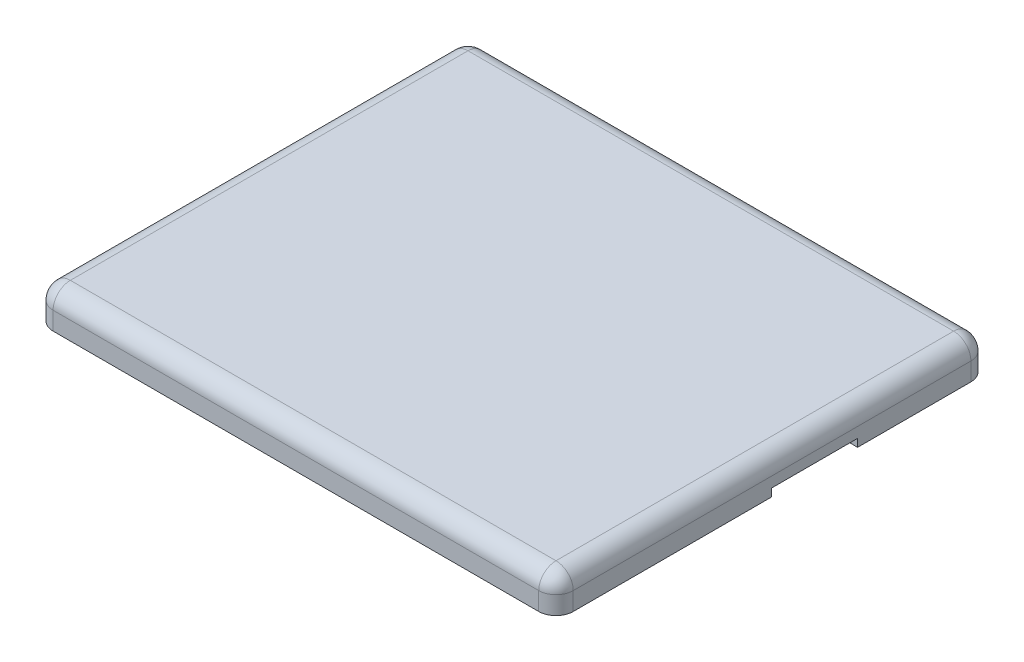
ISO-10303-21;
HEADER;
FILE_DESCRIPTION(('STEP AP214'),'2;1');
FILE_NAME('part.step','',(''),(''),'','','');
FILE_SCHEMA(('AUTOMOTIVE_DESIGN { 1 0 10303 214 1 1 1 1 }'));
ENDSEC;
DATA;
#1=APPLICATION_CONTEXT('core data for automotive mechanical design processes');
#2=APPLICATION_PROTOCOL_DEFINITION('international standard','automotive_design',2000,#1);
#3=PRODUCT_CONTEXT('',#1,'mechanical');
#4=PRODUCT('Part','Part','',(#3));
#5=PRODUCT_RELATED_PRODUCT_CATEGORY('part','',(#4));
#6=PRODUCT_DEFINITION_FORMATION('','',#4);
#7=PRODUCT_DEFINITION_CONTEXT('part definition',#1,'design');
#8=PRODUCT_DEFINITION('design','',#6,#7);
#9=PRODUCT_DEFINITION_SHAPE('','',#8);
#10=(LENGTH_UNIT() NAMED_UNIT(*) SI_UNIT(.MILLI.,.METRE.));
#11=(NAMED_UNIT(*) PLANE_ANGLE_UNIT() SI_UNIT($,.RADIAN.));
#12=(NAMED_UNIT(*) SI_UNIT($,.STERADIAN.) SOLID_ANGLE_UNIT());
#13=UNCERTAINTY_MEASURE_WITH_UNIT(LENGTH_MEASURE(1.E-05),#10,'distance_accuracy_value','');
#14=(GEOMETRIC_REPRESENTATION_CONTEXT(3) GLOBAL_UNCERTAINTY_ASSIGNED_CONTEXT((#13)) GLOBAL_UNIT_ASSIGNED_CONTEXT((#10,
#11,#12)) REPRESENTATION_CONTEXT('',''));
#15=CARTESIAN_POINT('',(0.,0.,0.));
#16=DIRECTION('',(0.,0.,1.));
#17=DIRECTION('',(1.,0.,0.));
#18=AXIS2_PLACEMENT_3D('',#15,#16,#17);
#19=CARTESIAN_POINT('',(-30.15,-2.,25.05));
#20=DIRECTION('',(-1.,0.,0.));
#21=DIRECTION('',(0.,0.,1.));
#22=AXIS2_PLACEMENT_3D('',#19,#20,#21);
#23=PLANE('',#22);
#24=DIRECTION('',(0.,0.,-1.));
#25=VECTOR('',#24,1.);
#26=CARTESIAN_POINT('',(-30.15,-4.1,-25.05));
#27=LINE('',#26,#25);
#28=CARTESIAN_POINT('',(-30.15,-4.1,23.05));
#29=VERTEX_POINT('',#28);
#30=CARTESIAN_POINT('',(-30.15,-4.1,-23.05));
#31=VERTEX_POINT('',#30);
#32=EDGE_CURVE('E227',#29,#31,#27,.T.);
#33=ORIENTED_EDGE('',*,*,#32,.F.);
#34=DIRECTION('',(0.,1.,0.));
#35=VECTOR('',#34,1.);
#36=CARTESIAN_POINT('',(-30.15,-2.,23.05));
#37=LINE('',#36,#35);
#38=CARTESIAN_POINT('',(-30.15,-2.,23.05));
#39=VERTEX_POINT('',#38);
#40=EDGE_CURVE('E264',#29,#39,#37,.T.);
#41=ORIENTED_EDGE('',*,*,#40,.T.);
#42=DIRECTION('',(0.,0.,1.));
#43=VECTOR('',#42,1.);
#44=CARTESIAN_POINT('',(-30.15,-2.,25.05));
#45=LINE('',#44,#43);
#46=CARTESIAN_POINT('',(-30.15,-2.,-23.05));
#47=VERTEX_POINT('',#46);
#48=EDGE_CURVE('E260',#39,#47,#45,.F.);
#49=ORIENTED_EDGE('',*,*,#48,.T.);
#50=DIRECTION('',(0.,1.,0.));
#51=VECTOR('',#50,1.);
#52=CARTESIAN_POINT('',(-30.15,-2.,-23.05));
#53=LINE('',#52,#51);
#54=EDGE_CURVE('E262',#47,#31,#53,.F.);
#55=ORIENTED_EDGE('',*,*,#54,.T.);
#56=EDGE_LOOP('',(#33,#41,#49,#55));
#57=FACE_BOUND('',#56,.T.);
#58=ADVANCED_FACE('F37',(#57),#23,.T.);
#59=CARTESIAN_POINT('',(30.15,-2.,-25.05));
#60=DIRECTION('',(0.,0.,-1.));
#61=DIRECTION('',(-1.,0.,0.));
#62=AXIS2_PLACEMENT_3D('',#59,#60,#61);
#63=PLANE('',#62);
#64=DIRECTION('',(1.,0.,0.));
#65=VECTOR('',#64,1.);
#66=CARTESIAN_POINT('',(-30.15,-4.1,-25.05));
#67=LINE('',#66,#65);
#68=CARTESIAN_POINT('',(-28.15,-4.1,-25.05));
#69=VERTEX_POINT('',#68);
#70=CARTESIAN_POINT('',(28.15,-4.1,-25.05));
#71=VERTEX_POINT('',#70);
#72=EDGE_CURVE('E230',#69,#71,#67,.T.);
#73=ORIENTED_EDGE('',*,*,#72,.F.);
#74=DIRECTION('',(0.,1.,0.));
#75=VECTOR('',#74,1.);
#76=CARTESIAN_POINT('',(-28.15,-2.,-25.05));
#77=LINE('',#76,#75);
#78=CARTESIAN_POINT('',(-28.15,-2.,-25.05));
#79=VERTEX_POINT('',#78);
#80=EDGE_CURVE('E11',#69,#79,#77,.T.);
#81=ORIENTED_EDGE('',*,*,#80,.T.);
#82=DIRECTION('',(-1.,0.,0.));
#83=VECTOR('',#82,1.);
#84=CARTESIAN_POINT('',(30.15,-2.,-25.05));
#85=LINE('',#84,#83);
#86=CARTESIAN_POINT('',(28.15,-2.,-25.05));
#87=VERTEX_POINT('',#86);
#88=EDGE_CURVE('E53',#79,#87,#85,.F.);
#89=ORIENTED_EDGE('',*,*,#88,.T.);
#90=DIRECTION('',(0.,1.,0.));
#91=VECTOR('',#90,1.);
#92=CARTESIAN_POINT('',(28.15,-2.,-25.05));
#93=LINE('',#92,#91);
#94=EDGE_CURVE('E46',#87,#71,#93,.F.);
#95=ORIENTED_EDGE('',*,*,#94,.T.);
#96=EDGE_LOOP('',(#73,#81,#89,#95));
#97=FACE_BOUND('',#96,.T.);
#98=ADVANCED_FACE('F385',(#97),#63,.T.);
#99=CARTESIAN_POINT('',(30.15,-2.,25.05));
#100=DIRECTION('',(1.,0.,0.));
#101=DIRECTION('',(0.,0.,-1.));
#102=AXIS2_PLACEMENT_3D('',#99,#100,#101);
#103=PLANE('',#102);
#104=DIRECTION('',(0.,0.,1.));
#105=VECTOR('',#104,1.);
#106=CARTESIAN_POINT('',(30.15,-4.1,-25.05));
#107=LINE('',#106,#105);
#108=CARTESIAN_POINT('',(30.15,-4.1,-23.05));
#109=VERTEX_POINT('',#108);
#110=CARTESIAN_POINT('',(30.15,-4.1,-9.9167528600836));
#111=VERTEX_POINT('',#110);
#112=EDGE_CURVE('E234',#109,#111,#107,.T.);
#113=ORIENTED_EDGE('',*,*,#112,.F.);
#114=DIRECTION('',(0.,1.,0.));
#115=VECTOR('',#114,1.);
#116=CARTESIAN_POINT('',(30.15,-2.,-23.05));
#117=LINE('',#116,#115);
#118=CARTESIAN_POINT('',(30.15,-2.,-23.05));
#119=VERTEX_POINT('',#118);
#120=EDGE_CURVE('E258',#109,#119,#117,.T.);
#121=ORIENTED_EDGE('',*,*,#120,.T.);
#122=DIRECTION('',(0.,0.,-1.));
#123=VECTOR('',#122,1.);
#124=CARTESIAN_POINT('',(30.15,-2.,25.05));
#125=LINE('',#124,#123);
#126=CARTESIAN_POINT('',(30.15,-2.,23.05));
#127=VERTEX_POINT('',#126);
#128=EDGE_CURVE('E255',#119,#127,#125,.F.);
#129=ORIENTED_EDGE('',*,*,#128,.T.);
#130=DIRECTION('',(0.,1.,0.));
#131=VECTOR('',#130,1.);
#132=CARTESIAN_POINT('',(30.15,-2.,23.05));
#133=LINE('',#132,#131);
#134=CARTESIAN_POINT('',(30.15,-4.1,23.05));
#135=VERTEX_POINT('',#134);
#136=EDGE_CURVE('E253',#127,#135,#133,.F.);
#137=ORIENTED_EDGE('',*,*,#136,.T.);
#138=CARTESIAN_POINT('',(30.15,-4.1,0.0832471399163925));
#139=VERTEX_POINT('',#138);
#140=EDGE_CURVE('E233',#139,#135,#107,.T.);
#141=ORIENTED_EDGE('',*,*,#140,.F.);
#142=DIRECTION('',(0.,-1.,0.));
#143=VECTOR('',#142,1.);
#144=CARTESIAN_POINT('',(30.15,-6.9,0.0832471399163925));
#145=LINE('',#144,#143);
#146=CARTESIAN_POINT('',(30.15,-3.2,0.0832471399163925));
#147=VERTEX_POINT('',#146);
#148=EDGE_CURVE('E183',#147,#139,#145,.T.);
#149=ORIENTED_EDGE('',*,*,#148,.F.);
#150=DIRECTION('',(0.,0.,1.));
#151=VECTOR('',#150,1.);
#152=CARTESIAN_POINT('',(30.15,-3.2,0.0832471399163925));
#153=LINE('',#152,#151);
#154=CARTESIAN_POINT('',(30.15,-3.2,-9.9167528600836));
#155=VERTEX_POINT('',#154);
#156=EDGE_CURVE('E167',#155,#147,#153,.T.);
#157=ORIENTED_EDGE('',*,*,#156,.F.);
#158=DIRECTION('',(0.,1.,0.));
#159=VECTOR('',#158,1.);
#160=CARTESIAN_POINT('',(30.15,-6.9,-9.9167528600836));
#161=LINE('',#160,#159);
#162=EDGE_CURVE('E177',#111,#155,#161,.T.);
#163=ORIENTED_EDGE('',*,*,#162,.F.);
#164=EDGE_LOOP('',(#113,#121,#129,#137,#141,#149,#157,#163));
#165=FACE_BOUND('',#164,.T.);
#166=ADVANCED_FACE('F185',(#165),#103,.T.);
#167=CARTESIAN_POINT('',(30.15,-2.,25.05));
#168=DIRECTION('',(0.,0.,1.));
#169=DIRECTION('',(1.,0.,0.));
#170=AXIS2_PLACEMENT_3D('',#167,#168,#169);
#171=PLANE('',#170);
#172=DIRECTION('',(1.,0.,0.));
#173=VECTOR('',#172,1.);
#174=CARTESIAN_POINT('',(30.15,-2.,25.05));
#175=LINE('',#174,#173);
#176=CARTESIAN_POINT('',(28.15,-2.,25.05));
#177=VERTEX_POINT('',#176);
#178=CARTESIAN_POINT('',(-28.15,-2.,25.05));
#179=VERTEX_POINT('',#178);
#180=EDGE_CURVE('E266',#177,#179,#175,.F.);
#181=ORIENTED_EDGE('',*,*,#180,.T.);
#182=DIRECTION('',(0.,1.,0.));
#183=VECTOR('',#182,1.);
#184=CARTESIAN_POINT('',(-28.15,-2.,25.05));
#185=LINE('',#184,#183);
#186=CARTESIAN_POINT('',(-28.15,-4.1,25.05));
#187=VERTEX_POINT('',#186);
#188=EDGE_CURVE('E270',#179,#187,#185,.F.);
#189=ORIENTED_EDGE('',*,*,#188,.T.);
#190=DIRECTION('',(-1.,0.,0.));
#191=VECTOR('',#190,1.);
#192=CARTESIAN_POINT('',(-30.15,-4.1,25.05));
#193=LINE('',#192,#191);
#194=CARTESIAN_POINT('',(28.15,-4.1,25.05));
#195=VERTEX_POINT('',#194);
#196=EDGE_CURVE('E236',#195,#187,#193,.T.);
#197=ORIENTED_EDGE('',*,*,#196,.F.);
#198=DIRECTION('',(0.,1.,0.));
#199=VECTOR('',#198,1.);
#200=CARTESIAN_POINT('',(28.15,-2.,25.05));
#201=LINE('',#200,#199);
#202=EDGE_CURVE('E268',#195,#177,#201,.T.);
#203=ORIENTED_EDGE('',*,*,#202,.T.);
#204=EDGE_LOOP('',(#181,#189,#197,#203));
#205=FACE_BOUND('',#204,.T.);
#206=ADVANCED_FACE('F334',(#205),#171,.T.);
#207=CARTESIAN_POINT('',(0.,0.,0.));
#208=DIRECTION('',(0.,1.,0.));
#209=DIRECTION('',(0.,0.,1.));
#210=AXIS2_PLACEMENT_3D('',#207,#208,#209);
#211=PLANE('',#210);
#212=DIRECTION('',(1.,0.,0.));
#213=VECTOR('',#212,1.);
#214=CARTESIAN_POINT('',(0.,0.,23.05));
#215=LINE('',#214,#213);
#216=CARTESIAN_POINT('',(-28.15,0.,23.05));
#217=VERTEX_POINT('',#216);
#218=CARTESIAN_POINT('',(28.15,0.,23.05));
#219=VERTEX_POINT('',#218);
#220=EDGE_CURVE('E248',#217,#219,#215,.T.);
#221=ORIENTED_EDGE('',*,*,#220,.T.);
#222=DIRECTION('',(0.,0.,-1.));
#223=VECTOR('',#222,1.);
#224=CARTESIAN_POINT('',(28.15,0.,0.));
#225=LINE('',#224,#223);
#226=CARTESIAN_POINT('',(28.15,0.,-23.05));
#227=VERTEX_POINT('',#226);
#228=EDGE_CURVE('E250',#219,#227,#225,.T.);
#229=ORIENTED_EDGE('',*,*,#228,.T.);
#230=DIRECTION('',(-1.,0.,0.));
#231=VECTOR('',#230,1.);
#232=CARTESIAN_POINT('',(0.,0.,-23.05));
#233=LINE('',#232,#231);
#234=CARTESIAN_POINT('',(-28.15,0.,-23.05));
#235=VERTEX_POINT('',#234);
#236=EDGE_CURVE('E244',#227,#235,#233,.T.);
#237=ORIENTED_EDGE('',*,*,#236,.T.);
#238=DIRECTION('',(0.,0.,1.));
#239=VECTOR('',#238,1.);
#240=CARTESIAN_POINT('',(-28.15,0.,0.));
#241=LINE('',#240,#239);
#242=EDGE_CURVE('E246',#235,#217,#241,.T.);
#243=ORIENTED_EDGE('',*,*,#242,.T.);
#244=EDGE_LOOP('',(#221,#229,#237,#243));
#245=FACE_BOUND('',#244,.T.);
#246=ADVANCED_FACE('F580',(#245),#211,.T.);
#247=CARTESIAN_POINT('',(0.,-4.1,0.));
#248=DIRECTION('',(0.,1.,0.));
#249=DIRECTION('',(0.,0.,1.));
#250=AXIS2_PLACEMENT_3D('',#247,#248,#249);
#251=PLANE('',#250);
#252=ORIENTED_EDGE('',*,*,#196,.T.);
#253=CARTESIAN_POINT('',(-28.15,-4.1,23.05));
#254=DIRECTION('',(0.,1.,0.));
#255=DIRECTION('',(0.,0.,1.));
#256=AXIS2_PLACEMENT_3D('',#253,#254,#255);
#257=CIRCLE('',#256,2.);
#258=EDGE_CURVE('E278',#187,#29,#257,.F.);
#259=ORIENTED_EDGE('',*,*,#258,.T.);
#260=ORIENTED_EDGE('',*,*,#32,.T.);
#261=CARTESIAN_POINT('',(-28.15,-4.1,-23.05));
#262=DIRECTION('',(0.,1.,0.));
#263=DIRECTION('',(0.,0.,1.));
#264=AXIS2_PLACEMENT_3D('',#261,#262,#263);
#265=CIRCLE('',#264,2.);
#266=EDGE_CURVE('E276',#31,#69,#265,.F.);
#267=ORIENTED_EDGE('',*,*,#266,.T.);
#268=ORIENTED_EDGE('',*,*,#72,.T.);
#269=CARTESIAN_POINT('',(28.15,-4.1,-23.05));
#270=DIRECTION('',(0.,1.,0.));
#271=DIRECTION('',(0.,0.,1.));
#272=AXIS2_PLACEMENT_3D('',#269,#270,#271);
#273=CIRCLE('',#272,2.);
#274=EDGE_CURVE('E274',#71,#109,#273,.F.);
#275=ORIENTED_EDGE('',*,*,#274,.T.);
#276=ORIENTED_EDGE('',*,*,#112,.T.);
#277=DIRECTION('',(-1.,0.,0.));
#278=VECTOR('',#277,1.);
#279=CARTESIAN_POINT('',(0.,-4.1,-9.9167528600836));
#280=LINE('',#279,#278);
#281=CARTESIAN_POINT('',(28.95,-4.1,-9.9167528600836));
#282=VERTEX_POINT('',#281);
#283=EDGE_CURVE('E180',#111,#282,#280,.T.);
#284=ORIENTED_EDGE('',*,*,#283,.T.);
#285=DIRECTION('',(0.,0.,1.));
#286=VECTOR('',#285,1.);
#287=CARTESIAN_POINT('',(28.95,-4.1,-23.85));
#288=LINE('',#287,#286);
#289=CARTESIAN_POINT('',(28.95,-4.1,-23.85));
#290=VERTEX_POINT('',#289);
#291=EDGE_CURVE('E200',#290,#282,#288,.T.);
#292=ORIENTED_EDGE('',*,*,#291,.F.);
#293=DIRECTION('',(1.,0.,0.));
#294=VECTOR('',#293,1.);
#295=CARTESIAN_POINT('',(-28.95,-4.1,-23.85));
#296=LINE('',#295,#294);
#297=CARTESIAN_POINT('',(-28.95,-4.1,-23.85));
#298=VERTEX_POINT('',#297);
#299=EDGE_CURVE('E196',#298,#290,#296,.T.);
#300=ORIENTED_EDGE('',*,*,#299,.F.);
#301=DIRECTION('',(0.,0.,-1.));
#302=VECTOR('',#301,1.);
#303=CARTESIAN_POINT('',(-28.95,-4.1,-23.85));
#304=LINE('',#303,#302);
#305=CARTESIAN_POINT('',(-28.95,-4.1,23.85));
#306=VERTEX_POINT('',#305);
#307=EDGE_CURVE('E206',#306,#298,#304,.T.);
#308=ORIENTED_EDGE('',*,*,#307,.F.);
#309=DIRECTION('',(-1.,0.,0.));
#310=VECTOR('',#309,1.);
#311=CARTESIAN_POINT('',(-28.95,-4.1,23.85));
#312=LINE('',#311,#310);
#313=CARTESIAN_POINT('',(28.95,-4.1,23.85));
#314=VERTEX_POINT('',#313);
#315=EDGE_CURVE('E203',#314,#306,#312,.T.);
#316=ORIENTED_EDGE('',*,*,#315,.F.);
#317=CARTESIAN_POINT('',(28.95,-4.1,0.0832471399163925));
#318=VERTEX_POINT('',#317);
#319=EDGE_CURVE('E198',#318,#314,#288,.T.);
#320=ORIENTED_EDGE('',*,*,#319,.F.);
#321=DIRECTION('',(1.,0.,0.));
#322=VECTOR('',#321,1.);
#323=CARTESIAN_POINT('',(0.,-4.1,0.0832471399163925));
#324=LINE('',#323,#322);
#325=EDGE_CURVE('E192',#318,#139,#324,.T.);
#326=ORIENTED_EDGE('',*,*,#325,.T.);
#327=ORIENTED_EDGE('',*,*,#140,.T.);
#328=CARTESIAN_POINT('',(28.15,-4.1,23.05));
#329=DIRECTION('',(0.,1.,0.));
#330=DIRECTION('',(0.,0.,1.));
#331=AXIS2_PLACEMENT_3D('',#328,#329,#330);
#332=CIRCLE('',#331,2.);
#333=EDGE_CURVE('E272',#135,#195,#332,.F.);
#334=ORIENTED_EDGE('',*,*,#333,.T.);
#335=EDGE_LOOP('',(#252,#259,#260,#267,#268,#275,#276,#284,#292,#300,#308,#316,#320,#326,#327,#334));
#336=FACE_BOUND('',#335,.T.);
#337=ADVANCED_FACE('F322',(#336),#251,.F.);
#338=CARTESIAN_POINT('',(-28.95,-4.1,-23.85));
#339=DIRECTION('',(0.,0.,1.));
#340=DIRECTION('',(1.,0.,0.));
#341=AXIS2_PLACEMENT_3D('',#338,#339,#340);
#342=PLANE('',#341);
#343=DIRECTION('',(1.,0.,0.));
#344=VECTOR('',#343,1.);
#345=CARTESIAN_POINT('',(-28.95,-2.,-23.85));
#346=LINE('',#345,#344);
#347=CARTESIAN_POINT('',(-28.95,-2.,-23.85));
#348=VERTEX_POINT('',#347);
#349=CARTESIAN_POINT('',(28.95,-2.,-23.85));
#350=VERTEX_POINT('',#349);
#351=EDGE_CURVE('E195',#348,#350,#346,.T.);
#352=ORIENTED_EDGE('',*,*,#351,.F.);
#353=DIRECTION('',(0.,1.,0.));
#354=VECTOR('',#353,1.);
#355=CARTESIAN_POINT('',(-28.95,-4.1,-23.85));
#356=LINE('',#355,#354);
#357=EDGE_CURVE('E208',#298,#348,#356,.T.);
#358=ORIENTED_EDGE('',*,*,#357,.F.);
#359=ORIENTED_EDGE('',*,*,#299,.T.);
#360=DIRECTION('',(0.,1.,0.));
#361=VECTOR('',#360,1.);
#362=CARTESIAN_POINT('',(28.95,-4.1,-23.85));
#363=LINE('',#362,#361);
#364=EDGE_CURVE('E224',#290,#350,#363,.T.);
#365=ORIENTED_EDGE('',*,*,#364,.T.);
#366=EDGE_LOOP('',(#352,#358,#359,#365));
#367=FACE_BOUND('',#366,.T.);
#368=ADVANCED_FACE('F561',(#367),#342,.T.);
#369=CARTESIAN_POINT('',(28.95,-4.1,-23.85));
#370=DIRECTION('',(-1.,0.,0.));
#371=DIRECTION('',(0.,0.,1.));
#372=AXIS2_PLACEMENT_3D('',#369,#370,#371);
#373=PLANE('',#372);
#374=DIRECTION('',(0.,1.,0.));
#375=VECTOR('',#374,1.);
#376=CARTESIAN_POINT('',(28.95,-4.1,0.0832471399163925));
#377=LINE('',#376,#375);
#378=CARTESIAN_POINT('',(28.95,-3.2,0.0832471399163925));
#379=VERTEX_POINT('',#378);
#380=EDGE_CURVE('E242',#318,#379,#377,.T.);
#381=ORIENTED_EDGE('',*,*,#380,.F.);
#382=ORIENTED_EDGE('',*,*,#319,.T.);
#383=DIRECTION('',(0.,1.,0.));
#384=VECTOR('',#383,1.);
#385=CARTESIAN_POINT('',(28.95,-4.1,23.85));
#386=LINE('',#385,#384);
#387=CARTESIAN_POINT('',(28.95,-2.,23.85));
#388=VERTEX_POINT('',#387);
#389=EDGE_CURVE('E222',#314,#388,#386,.T.);
#390=ORIENTED_EDGE('',*,*,#389,.T.);
#391=DIRECTION('',(0.,0.,1.));
#392=VECTOR('',#391,1.);
#393=CARTESIAN_POINT('',(28.95,-2.,-23.85));
#394=LINE('',#393,#392);
#395=EDGE_CURVE('E211',#350,#388,#394,.T.);
#396=ORIENTED_EDGE('',*,*,#395,.F.);
#397=ORIENTED_EDGE('',*,*,#364,.F.);
#398=ORIENTED_EDGE('',*,*,#291,.T.);
#399=DIRECTION('',(0.,-1.,0.));
#400=VECTOR('',#399,1.);
#401=CARTESIAN_POINT('',(28.95,-4.1,-9.9167528600836));
#402=LINE('',#401,#400);
#403=CARTESIAN_POINT('',(28.95,-3.2,-9.9167528600836));
#404=VERTEX_POINT('',#403);
#405=EDGE_CURVE('E239',#404,#282,#402,.T.);
#406=ORIENTED_EDGE('',*,*,#405,.F.);
#407=DIRECTION('',(0.,0.,-1.));
#408=VECTOR('',#407,1.);
#409=CARTESIAN_POINT('',(28.95,-3.2,-23.85));
#410=LINE('',#409,#408);
#411=EDGE_CURVE('E170',#379,#404,#410,.T.);
#412=ORIENTED_EDGE('',*,*,#411,.F.);
#413=EDGE_LOOP('',(#381,#382,#390,#396,#397,#398,#406,#412));
#414=FACE_BOUND('',#413,.T.);
#415=ADVANCED_FACE('F550',(#414),#373,.T.);
#416=CARTESIAN_POINT('',(-28.95,-4.1,23.85));
#417=DIRECTION('',(0.,0.,-1.));
#418=DIRECTION('',(-1.,0.,0.));
#419=AXIS2_PLACEMENT_3D('',#416,#417,#418);
#420=PLANE('',#419);
#421=DIRECTION('',(-1.,0.,0.));
#422=VECTOR('',#421,1.);
#423=CARTESIAN_POINT('',(-28.95,-2.,23.85));
#424=LINE('',#423,#422);
#425=CARTESIAN_POINT('',(-28.95,-2.,23.85));
#426=VERTEX_POINT('',#425);
#427=EDGE_CURVE('E214',#388,#426,#424,.T.);
#428=ORIENTED_EDGE('',*,*,#427,.F.);
#429=ORIENTED_EDGE('',*,*,#389,.F.);
#430=ORIENTED_EDGE('',*,*,#315,.T.);
#431=DIRECTION('',(0.,1.,0.));
#432=VECTOR('',#431,1.);
#433=CARTESIAN_POINT('',(-28.95,-4.1,23.85));
#434=LINE('',#433,#432);
#435=EDGE_CURVE('E220',#306,#426,#434,.T.);
#436=ORIENTED_EDGE('',*,*,#435,.T.);
#437=EDGE_LOOP('',(#428,#429,#430,#436));
#438=FACE_BOUND('',#437,.T.);
#439=ADVANCED_FACE('F538',(#438),#420,.T.);
#440=CARTESIAN_POINT('',(-28.95,-4.1,-23.85));
#441=DIRECTION('',(1.,0.,0.));
#442=DIRECTION('',(0.,0.,-1.));
#443=AXIS2_PLACEMENT_3D('',#440,#441,#442);
#444=PLANE('',#443);
#445=DIRECTION('',(0.,0.,-1.));
#446=VECTOR('',#445,1.);
#447=CARTESIAN_POINT('',(-28.95,-2.,-23.85));
#448=LINE('',#447,#446);
#449=EDGE_CURVE('E199',#426,#348,#448,.T.);
#450=ORIENTED_EDGE('',*,*,#449,.F.);
#451=ORIENTED_EDGE('',*,*,#435,.F.);
#452=ORIENTED_EDGE('',*,*,#307,.T.);
#453=ORIENTED_EDGE('',*,*,#357,.T.);
#454=EDGE_LOOP('',(#450,#451,#452,#453));
#455=FACE_BOUND('',#454,.T.);
#456=ADVANCED_FACE('F532',(#455),#444,.T.);
#457=CARTESIAN_POINT('',(0.,-2.,0.));
#458=DIRECTION('',(0.,1.,0.));
#459=DIRECTION('',(0.,0.,1.));
#460=AXIS2_PLACEMENT_3D('',#457,#458,#459);
#461=PLANE('',#460);
#462=ORIENTED_EDGE('',*,*,#449,.T.);
#463=ORIENTED_EDGE('',*,*,#351,.T.);
#464=ORIENTED_EDGE('',*,*,#395,.T.);
#465=ORIENTED_EDGE('',*,*,#427,.T.);
#466=EDGE_LOOP('',(#462,#463,#464,#465));
#467=FACE_BOUND('',#466,.T.);
#468=ADVANCED_FACE('F526',(#467),#461,.F.);
#469=CARTESIAN_POINT('',(10.15,-6.9,0.0832471399163925));
#470=DIRECTION('',(0.,0.,1.));
#471=DIRECTION('',(1.,0.,0.));
#472=AXIS2_PLACEMENT_3D('',#469,#470,#471);
#473=PLANE('',#472);
#474=ORIENTED_EDGE('',*,*,#380,.T.);
#475=DIRECTION('',(1.,0.,0.));
#476=VECTOR('',#475,1.);
#477=CARTESIAN_POINT('',(10.15,-3.2,0.0832471399163925));
#478=LINE('',#477,#476);
#479=EDGE_CURVE('E173',#379,#147,#478,.T.);
#480=ORIENTED_EDGE('',*,*,#479,.T.);
#481=ORIENTED_EDGE('',*,*,#148,.T.);
#482=ORIENTED_EDGE('',*,*,#325,.F.);
#483=EDGE_LOOP('',(#474,#480,#481,#482));
#484=FACE_BOUND('',#483,.T.);
#485=ADVANCED_FACE('F317',(#484),#473,.F.);
#486=CARTESIAN_POINT('',(10.15,-6.9,-9.9167528600836));
#487=DIRECTION('',(0.,0.,-1.));
#488=DIRECTION('',(-1.,0.,0.));
#489=AXIS2_PLACEMENT_3D('',#486,#487,#488);
#490=PLANE('',#489);
#491=ORIENTED_EDGE('',*,*,#162,.T.);
#492=DIRECTION('',(1.,0.,0.));
#493=VECTOR('',#492,1.);
#494=CARTESIAN_POINT('',(10.15,-3.2,-9.9167528600836));
#495=LINE('',#494,#493);
#496=EDGE_CURVE('E162',#404,#155,#495,.T.);
#497=ORIENTED_EDGE('',*,*,#496,.F.);
#498=ORIENTED_EDGE('',*,*,#405,.T.);
#499=ORIENTED_EDGE('',*,*,#283,.F.);
#500=EDGE_LOOP('',(#491,#497,#498,#499));
#501=FACE_BOUND('',#500,.T.);
#502=ADVANCED_FACE('F178',(#501),#490,.F.);
#503=CARTESIAN_POINT('',(10.15,-3.2,0.0832471399163925));
#504=DIRECTION('',(0.,1.,0.));
#505=DIRECTION('',(0.,0.,1.));
#506=AXIS2_PLACEMENT_3D('',#503,#504,#505);
#507=PLANE('',#506);
#508=ORIENTED_EDGE('',*,*,#411,.T.);
#509=ORIENTED_EDGE('',*,*,#496,.T.);
#510=ORIENTED_EDGE('',*,*,#156,.T.);
#511=ORIENTED_EDGE('',*,*,#479,.F.);
#512=EDGE_LOOP('',(#508,#509,#510,#511));
#513=FACE_BOUND('',#512,.T.);
#514=ADVANCED_FACE('F164',(#513),#507,.F.);
#515=CARTESIAN_POINT('',(-28.15,-2.,23.05));
#516=DIRECTION('',(0.,1.,0.));
#517=DIRECTION('',(0.,0.,1.));
#518=AXIS2_PLACEMENT_3D('',#515,#516,#517);
#519=CYLINDRICAL_SURFACE('',#518,2.);
#520=ORIENTED_EDGE('',*,*,#258,.F.);
#521=ORIENTED_EDGE('',*,*,#188,.F.);
#522=CARTESIAN_POINT('',(-28.15,-2.,23.05));
#523=DIRECTION('',(0.,1.,0.));
#524=DIRECTION('',(0.,0.,1.));
#525=AXIS2_PLACEMENT_3D('',#522,#523,#524);
#526=CIRCLE('',#525,2.);
#527=EDGE_CURVE('E41',#39,#179,#526,.T.);
#528=ORIENTED_EDGE('',*,*,#527,.F.);
#529=ORIENTED_EDGE('',*,*,#40,.F.);
#530=EDGE_LOOP('',(#520,#521,#528,#529));
#531=FACE_BOUND('',#530,.T.);
#532=ADVANCED_FACE('F39',(#531),#519,.T.);
#533=CARTESIAN_POINT('',(-28.15,-2.,0.));
#534=DIRECTION('',(0.,0.,1.));
#535=DIRECTION('',(1.,0.,0.));
#536=AXIS2_PLACEMENT_3D('',#533,#534,#535);
#537=CYLINDRICAL_SURFACE('',#536,2.);
#538=CARTESIAN_POINT('',(-28.15,-2.,-23.05));
#539=DIRECTION('',(0.,0.,-1.));
#540=DIRECTION('',(-1.,0.,0.));
#541=AXIS2_PLACEMENT_3D('',#538,#539,#540);
#542=CIRCLE('',#541,2.);
#543=EDGE_CURVE('E307',#47,#235,#542,.T.);
#544=ORIENTED_EDGE('',*,*,#543,.F.);
#545=ORIENTED_EDGE('',*,*,#48,.F.);
#546=CARTESIAN_POINT('',(-28.15,-2.,23.05));
#547=DIRECTION('',(0.,0.,1.));
#548=DIRECTION('',(1.,0.,0.));
#549=AXIS2_PLACEMENT_3D('',#546,#547,#548);
#550=CIRCLE('',#549,2.);
#551=EDGE_CURVE('E309',#217,#39,#550,.T.);
#552=ORIENTED_EDGE('',*,*,#551,.F.);
#553=ORIENTED_EDGE('',*,*,#242,.F.);
#554=EDGE_LOOP('',(#544,#545,#552,#553));
#555=FACE_BOUND('',#554,.T.);
#556=ADVANCED_FACE('F350',(#555),#537,.T.);
#557=CARTESIAN_POINT('',(-28.15,-2.,-23.05));
#558=DIRECTION('',(0.,1.,0.));
#559=DIRECTION('',(0.,0.,1.));
#560=AXIS2_PLACEMENT_3D('',#557,#558,#559);
#561=CYLINDRICAL_SURFACE('',#560,2.);
#562=ORIENTED_EDGE('',*,*,#266,.F.);
#563=ORIENTED_EDGE('',*,*,#54,.F.);
#564=CARTESIAN_POINT('',(-28.15,-2.,-23.05));
#565=DIRECTION('',(0.,1.,0.));
#566=DIRECTION('',(0.,0.,1.));
#567=AXIS2_PLACEMENT_3D('',#564,#565,#566);
#568=CIRCLE('',#567,2.);
#569=EDGE_CURVE('E304',#79,#47,#568,.T.);
#570=ORIENTED_EDGE('',*,*,#569,.F.);
#571=ORIENTED_EDGE('',*,*,#80,.F.);
#572=EDGE_LOOP('',(#562,#563,#570,#571));
#573=FACE_BOUND('',#572,.T.);
#574=ADVANCED_FACE('F346',(#573),#561,.T.);
#575=CARTESIAN_POINT('',(-28.15,-2.,23.05));
#576=DIRECTION('',(-1.,0.,0.));
#577=DIRECTION('',(0.,0.,1.));
#578=AXIS2_PLACEMENT_3D('',#575,#576,#577);
#579=SPHERICAL_SURFACE('',#578,2.);
#580=ORIENTED_EDGE('',*,*,#551,.T.);
#581=ORIENTED_EDGE('',*,*,#527,.T.);
#582=CARTESIAN_POINT('',(-28.15,-2.,23.05));
#583=DIRECTION('',(-1.,0.,0.));
#584=DIRECTION('',(0.,0.,1.));
#585=AXIS2_PLACEMENT_3D('',#582,#583,#584);
#586=CIRCLE('',#585,2.);
#587=EDGE_CURVE('E301',#217,#179,#586,.F.);
#588=ORIENTED_EDGE('',*,*,#587,.F.);
#589=EDGE_LOOP('',(#580,#581,#588));
#590=FACE_BOUND('',#589,.T.);
#591=ADVANCED_FACE('F375',(#590),#579,.T.);
#592=CARTESIAN_POINT('',(-28.15,-2.,-23.05));
#593=DIRECTION('',(-1.,0.,0.));
#594=DIRECTION('',(0.,0.,1.));
#595=AXIS2_PLACEMENT_3D('',#592,#593,#594);
#596=SPHERICAL_SURFACE('',#595,2.);
#597=ORIENTED_EDGE('',*,*,#569,.T.);
#598=ORIENTED_EDGE('',*,*,#543,.T.);
#599=CARTESIAN_POINT('',(-28.15,-2.,-23.05));
#600=DIRECTION('',(-1.,0.,0.));
#601=DIRECTION('',(0.,0.,1.));
#602=AXIS2_PLACEMENT_3D('',#599,#600,#601);
#603=CIRCLE('',#602,2.);
#604=EDGE_CURVE('E298',#79,#235,#603,.F.);
#605=ORIENTED_EDGE('',*,*,#604,.F.);
#606=EDGE_LOOP('',(#597,#598,#605));
#607=FACE_BOUND('',#606,.T.);
#608=ADVANCED_FACE('F352',(#607),#596,.T.);
#609=CARTESIAN_POINT('',(28.15,-2.,23.05));
#610=DIRECTION('',(0.,1.,0.));
#611=DIRECTION('',(0.,0.,1.));
#612=AXIS2_PLACEMENT_3D('',#609,#610,#611);
#613=CYLINDRICAL_SURFACE('',#612,2.);
#614=ORIENTED_EDGE('',*,*,#333,.F.);
#615=ORIENTED_EDGE('',*,*,#136,.F.);
#616=CARTESIAN_POINT('',(28.15,-2.,23.05));
#617=DIRECTION('',(0.,1.,0.));
#618=DIRECTION('',(0.,0.,1.));
#619=AXIS2_PLACEMENT_3D('',#616,#617,#618);
#620=CIRCLE('',#619,2.);
#621=EDGE_CURVE('E295',#177,#127,#620,.T.);
#622=ORIENTED_EDGE('',*,*,#621,.F.);
#623=ORIENTED_EDGE('',*,*,#202,.F.);
#624=EDGE_LOOP('',(#614,#615,#622,#623));
#625=FACE_BOUND('',#624,.T.);
#626=ADVANCED_FACE('F329',(#625),#613,.T.);
#627=CARTESIAN_POINT('',(0.,-2.,23.05));
#628=DIRECTION('',(1.,0.,0.));
#629=DIRECTION('',(0.,0.,-1.));
#630=AXIS2_PLACEMENT_3D('',#627,#628,#629);
#631=CYLINDRICAL_SURFACE('',#630,2.);
#632=ORIENTED_EDGE('',*,*,#587,.T.);
#633=ORIENTED_EDGE('',*,*,#180,.F.);
#634=CARTESIAN_POINT('',(28.15,-2.,23.05));
#635=DIRECTION('',(1.,0.,0.));
#636=DIRECTION('',(0.,0.,-1.));
#637=AXIS2_PLACEMENT_3D('',#634,#635,#636);
#638=CIRCLE('',#637,2.);
#639=EDGE_CURVE('E292',#219,#177,#638,.T.);
#640=ORIENTED_EDGE('',*,*,#639,.F.);
#641=ORIENTED_EDGE('',*,*,#220,.F.);
#642=EDGE_LOOP('',(#632,#633,#640,#641));
#643=FACE_BOUND('',#642,.T.);
#644=ADVANCED_FACE('F374',(#643),#631,.T.);
#645=CARTESIAN_POINT('',(0.,-2.,-23.05));
#646=DIRECTION('',(-1.,0.,0.));
#647=DIRECTION('',(0.,0.,1.));
#648=AXIS2_PLACEMENT_3D('',#645,#646,#647);
#649=CYLINDRICAL_SURFACE('',#648,2.);
#650=ORIENTED_EDGE('',*,*,#604,.T.);
#651=ORIENTED_EDGE('',*,*,#236,.F.);
#652=CARTESIAN_POINT('',(28.15,-2.,-23.05));
#653=DIRECTION('',(1.,0.,0.));
#654=DIRECTION('',(0.,0.,-1.));
#655=AXIS2_PLACEMENT_3D('',#652,#653,#654);
#656=CIRCLE('',#655,2.);
#657=EDGE_CURVE('E289',#87,#227,#656,.T.);
#658=ORIENTED_EDGE('',*,*,#657,.F.);
#659=ORIENTED_EDGE('',*,*,#88,.F.);
#660=EDGE_LOOP('',(#650,#651,#658,#659));
#661=FACE_BOUND('',#660,.T.);
#662=ADVANCED_FACE('F356',(#661),#649,.T.);
#663=CARTESIAN_POINT('',(28.15,-2.,-23.05));
#664=DIRECTION('',(0.,1.,0.));
#665=DIRECTION('',(0.,0.,1.));
#666=AXIS2_PLACEMENT_3D('',#663,#664,#665);
#667=CYLINDRICAL_SURFACE('',#666,2.);
#668=ORIENTED_EDGE('',*,*,#274,.F.);
#669=ORIENTED_EDGE('',*,*,#94,.F.);
#670=CARTESIAN_POINT('',(28.15,-2.,-23.05));
#671=DIRECTION('',(0.,1.,0.));
#672=DIRECTION('',(0.,0.,1.));
#673=AXIS2_PLACEMENT_3D('',#670,#671,#672);
#674=CIRCLE('',#673,2.);
#675=EDGE_CURVE('E286',#119,#87,#674,.T.);
#676=ORIENTED_EDGE('',*,*,#675,.F.);
#677=ORIENTED_EDGE('',*,*,#120,.F.);
#678=EDGE_LOOP('',(#668,#669,#676,#677));
#679=FACE_BOUND('',#678,.T.);
#680=ADVANCED_FACE('F364',(#679),#667,.T.);
#681=CARTESIAN_POINT('',(28.15,-2.,23.05));
#682=DIRECTION('',(0.,0.,1.));
#683=DIRECTION('',(1.,0.,0.));
#684=AXIS2_PLACEMENT_3D('',#681,#682,#683);
#685=SPHERICAL_SURFACE('',#684,2.);
#686=ORIENTED_EDGE('',*,*,#639,.T.);
#687=ORIENTED_EDGE('',*,*,#621,.T.);
#688=CARTESIAN_POINT('',(28.15,-2.,23.05));
#689=DIRECTION('',(0.,0.,1.));
#690=DIRECTION('',(1.,0.,0.));
#691=AXIS2_PLACEMENT_3D('',#688,#689,#690);
#692=CIRCLE('',#691,2.);
#693=EDGE_CURVE('E284',#219,#127,#692,.F.);
#694=ORIENTED_EDGE('',*,*,#693,.F.);
#695=EDGE_LOOP('',(#686,#687,#694));
#696=FACE_BOUND('',#695,.T.);
#697=ADVANCED_FACE('F370',(#696),#685,.T.);
#698=CARTESIAN_POINT('',(28.15,-2.,-23.05));
#699=DIRECTION('',(0.,0.,-1.));
#700=DIRECTION('',(-1.,0.,0.));
#701=AXIS2_PLACEMENT_3D('',#698,#699,#700);
#702=SPHERICAL_SURFACE('',#701,2.);
#703=ORIENTED_EDGE('',*,*,#675,.T.);
#704=ORIENTED_EDGE('',*,*,#657,.T.);
#705=CARTESIAN_POINT('',(28.15,-2.,-23.05));
#706=DIRECTION('',(0.,0.,-1.));
#707=DIRECTION('',(-1.,0.,0.));
#708=AXIS2_PLACEMENT_3D('',#705,#706,#707);
#709=CIRCLE('',#708,2.);
#710=EDGE_CURVE('E282',#119,#227,#709,.F.);
#711=ORIENTED_EDGE('',*,*,#710,.F.);
#712=EDGE_LOOP('',(#703,#704,#711));
#713=FACE_BOUND('',#712,.T.);
#714=ADVANCED_FACE('F360',(#713),#702,.T.);
#715=CARTESIAN_POINT('',(28.15,-2.,0.));
#716=DIRECTION('',(0.,0.,-1.));
#717=DIRECTION('',(-1.,0.,0.));
#718=AXIS2_PLACEMENT_3D('',#715,#716,#717);
#719=CYLINDRICAL_SURFACE('',#718,2.);
#720=ORIENTED_EDGE('',*,*,#693,.T.);
#721=ORIENTED_EDGE('',*,*,#128,.F.);
#722=ORIENTED_EDGE('',*,*,#710,.T.);
#723=ORIENTED_EDGE('',*,*,#228,.F.);
#724=EDGE_LOOP('',(#720,#721,#722,#723));
#725=FACE_BOUND('',#724,.T.);
#726=ADVANCED_FACE('F366',(#725),#719,.T.);
#727=CLOSED_SHELL('',(#58,#98,#166,#206,#246,#337,#368,#415,#439,#456,#468,#485,#502,#514,#532,
#556,#574,#591,#608,#626,#644,#662,#680,#697,#714,#726));
#728=MANIFOLD_SOLID_BREP('B2',#727);
#729=ADVANCED_BREP_SHAPE_REPRESENTATION('',(#18,#728),#14);
#730=SHAPE_DEFINITION_REPRESENTATION(#9,#729);
ENDSEC;
END-ISO-10303-21;
